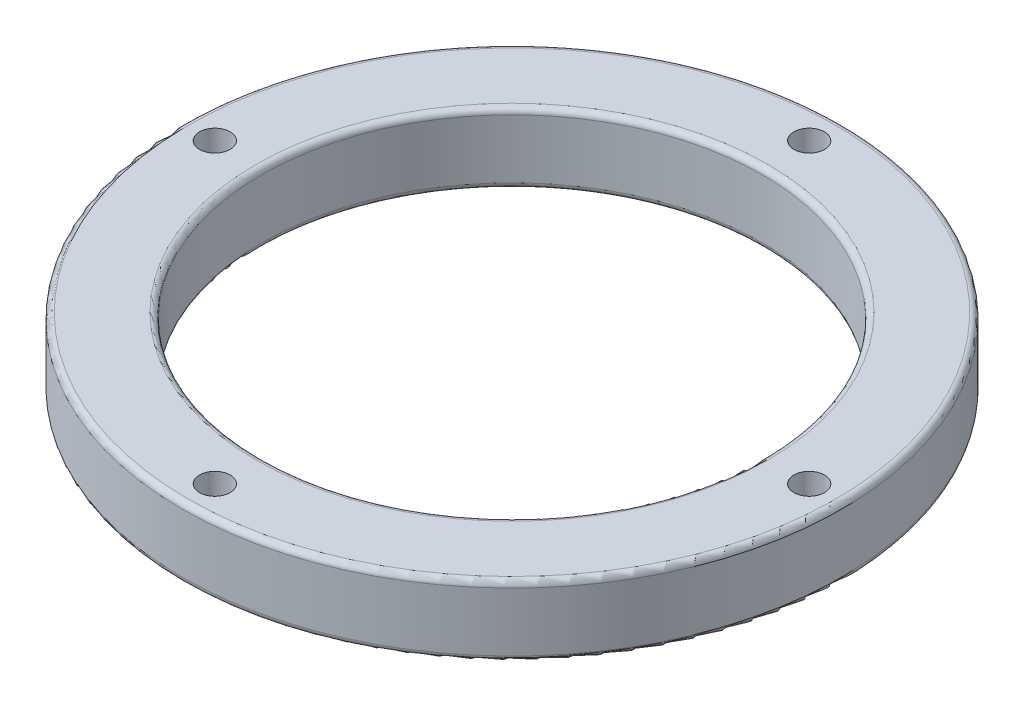
ISO-10303-21;
HEADER;
FILE_DESCRIPTION(('STEP AP214'),'2;1');
FILE_NAME('part.step','',(''),(''),'','','');
FILE_SCHEMA(('AUTOMOTIVE_DESIGN { 1 0 10303 214 1 1 1 1 }'));
ENDSEC;
DATA;
#1=APPLICATION_CONTEXT('core data for automotive mechanical design processes');
#2=APPLICATION_PROTOCOL_DEFINITION('international standard','automotive_design',2000,#1);
#3=PRODUCT_CONTEXT('',#1,'mechanical');
#4=PRODUCT('Part','Part','',(#3));
#5=PRODUCT_RELATED_PRODUCT_CATEGORY('part','',(#4));
#6=PRODUCT_DEFINITION_FORMATION('','',#4);
#7=PRODUCT_DEFINITION_CONTEXT('part definition',#1,'design');
#8=PRODUCT_DEFINITION('design','',#6,#7);
#9=PRODUCT_DEFINITION_SHAPE('','',#8);
#10=(LENGTH_UNIT() NAMED_UNIT(*) SI_UNIT(.MILLI.,.METRE.));
#11=(NAMED_UNIT(*) PLANE_ANGLE_UNIT() SI_UNIT($,.RADIAN.));
#12=(NAMED_UNIT(*) SI_UNIT($,.STERADIAN.) SOLID_ANGLE_UNIT());
#13=UNCERTAINTY_MEASURE_WITH_UNIT(LENGTH_MEASURE(1.E-05),#10,'distance_accuracy_value','');
#14=(GEOMETRIC_REPRESENTATION_CONTEXT(3) GLOBAL_UNCERTAINTY_ASSIGNED_CONTEXT((#13)) GLOBAL_UNIT_ASSIGNED_CONTEXT((#10,
#11,#12)) REPRESENTATION_CONTEXT('',''));
#15=CARTESIAN_POINT('',(0.,0.,0.));
#16=DIRECTION('',(0.,0.,1.));
#17=DIRECTION('',(1.,0.,0.));
#18=AXIS2_PLACEMENT_3D('',#15,#16,#17);
#19=CARTESIAN_POINT('',(0.,12.,0.));
#20=DIRECTION('',(0.,1.,0.));
#21=DIRECTION('',(0.,0.,1.));
#22=AXIS2_PLACEMENT_3D('',#19,#20,#21);
#23=PLANE('',#22);
#24=CARTESIAN_POINT('',(0.,12.,0.));
#25=DIRECTION('',(0.,1.,0.));
#26=DIRECTION('',(0.,0.,1.));
#27=AXIS2_PLACEMENT_3D('',#24,#25,#26);
#28=CIRCLE('',#27,55.);
#29=CARTESIAN_POINT('',(0.,12.,55.));
#30=VERTEX_POINT('',#29);
#31=EDGE_CURVE('E43',#30,#30,#28,.T.);
#32=ORIENTED_EDGE('',*,*,#31,.T.);
#33=EDGE_LOOP('',(#32));
#34=FACE_BOUND('',#33,.T.);
#35=CARTESIAN_POINT('',(0.,12.,0.));
#36=DIRECTION('',(0.,1.,0.));
#37=DIRECTION('',(0.,0.,1.));
#38=AXIS2_PLACEMENT_3D('',#35,#36,#37);
#39=CIRCLE('',#38,43.5);
#40=CARTESIAN_POINT('',(0.,12.,43.5));
#41=VERTEX_POINT('',#40);
#42=EDGE_CURVE('E47',#41,#41,#39,.F.);
#43=ORIENTED_EDGE('',*,*,#42,.T.);
#44=EDGE_LOOP('',(#43));
#45=FACE_BOUND('',#44,.T.);
#46=CARTESIAN_POINT('',(-50.5,12.,0.));
#47=DIRECTION('',(0.,1.,0.));
#48=DIRECTION('',(0.,0.,1.));
#49=AXIS2_PLACEMENT_3D('',#46,#47,#48);
#50=CIRCLE('',#49,2.6);
#51=CARTESIAN_POINT('',(-50.5,12.,2.6));
#52=VERTEX_POINT('',#51);
#53=EDGE_CURVE('E74',#52,#52,#50,.T.);
#54=ORIENTED_EDGE('',*,*,#53,.F.);
#55=EDGE_LOOP('',(#54));
#56=FACE_BOUND('',#55,.T.);
#57=CARTESIAN_POINT('',(50.5,12.,0.));
#58=DIRECTION('',(0.,1.,0.));
#59=DIRECTION('',(0.,0.,1.));
#60=AXIS2_PLACEMENT_3D('',#57,#58,#59);
#61=CIRCLE('',#60,2.6);
#62=CARTESIAN_POINT('',(50.5,12.,2.6));
#63=VERTEX_POINT('',#62);
#64=EDGE_CURVE('E64',#63,#63,#61,.T.);
#65=ORIENTED_EDGE('',*,*,#64,.F.);
#66=EDGE_LOOP('',(#65));
#67=FACE_BOUND('',#66,.T.);
#68=CARTESIAN_POINT('',(0.,12.,50.5));
#69=DIRECTION('',(0.,1.,0.));
#70=DIRECTION('',(0.,0.,1.));
#71=AXIS2_PLACEMENT_3D('',#68,#69,#70);
#72=CIRCLE('',#71,2.6);
#73=CARTESIAN_POINT('',(0.,12.,53.1));
#74=VERTEX_POINT('',#73);
#75=EDGE_CURVE('E68',#74,#74,#72,.T.);
#76=ORIENTED_EDGE('',*,*,#75,.F.);
#77=EDGE_LOOP('',(#76));
#78=FACE_BOUND('',#77,.T.);
#79=CARTESIAN_POINT('',(0.,12.,-50.5));
#80=DIRECTION('',(0.,1.,0.));
#81=DIRECTION('',(0.,0.,1.));
#82=AXIS2_PLACEMENT_3D('',#79,#80,#81);
#83=CIRCLE('',#82,2.6);
#84=CARTESIAN_POINT('',(0.,12.,-47.9));
#85=VERTEX_POINT('',#84);
#86=EDGE_CURVE('E80',#85,#85,#83,.T.);
#87=ORIENTED_EDGE('',*,*,#86,.F.);
#88=EDGE_LOOP('',(#87));
#89=FACE_BOUND('',#88,.T.);
#90=ADVANCED_FACE('F32',(#34,#45,#56,#67,#78,#89),#23,.T.);
#91=CARTESIAN_POINT('',(0.,0.,0.));
#92=DIRECTION('',(0.,1.,0.));
#93=DIRECTION('',(0.,0.,1.));
#94=AXIS2_PLACEMENT_3D('',#91,#92,#93);
#95=PLANE('',#94);
#96=CARTESIAN_POINT('',(0.,0.,0.));
#97=DIRECTION('',(0.,1.,0.));
#98=DIRECTION('',(0.,0.,1.));
#99=AXIS2_PLACEMENT_3D('',#96,#97,#98);
#100=CIRCLE('',#99,55.);
#101=CARTESIAN_POINT('',(0.,0.,55.));
#102=VERTEX_POINT('',#101);
#103=EDGE_CURVE('E52',#102,#102,#100,.F.);
#104=ORIENTED_EDGE('',*,*,#103,.T.);
#105=EDGE_LOOP('',(#104));
#106=FACE_BOUND('',#105,.T.);
#107=CARTESIAN_POINT('',(0.,0.,0.));
#108=DIRECTION('',(0.,1.,0.));
#109=DIRECTION('',(0.,0.,1.));
#110=AXIS2_PLACEMENT_3D('',#107,#108,#109);
#111=CIRCLE('',#110,43.5);
#112=CARTESIAN_POINT('',(0.,0.,43.5));
#113=VERTEX_POINT('',#112);
#114=EDGE_CURVE('E55',#113,#113,#111,.T.);
#115=ORIENTED_EDGE('',*,*,#114,.T.);
#116=EDGE_LOOP('',(#115));
#117=FACE_BOUND('',#116,.T.);
#118=CARTESIAN_POINT('',(50.5,0.,0.));
#119=DIRECTION('',(0.,1.,0.));
#120=DIRECTION('',(0.,0.,1.));
#121=AXIS2_PLACEMENT_3D('',#118,#119,#120);
#122=CIRCLE('',#121,2.6);
#123=CARTESIAN_POINT('',(50.5,0.,2.6));
#124=VERTEX_POINT('',#123);
#125=EDGE_CURVE('E65',#124,#124,#122,.T.);
#126=ORIENTED_EDGE('',*,*,#125,.T.);
#127=EDGE_LOOP('',(#126));
#128=FACE_BOUND('',#127,.T.);
#129=CARTESIAN_POINT('',(0.,0.,50.5));
#130=DIRECTION('',(0.,1.,0.));
#131=DIRECTION('',(0.,0.,1.));
#132=AXIS2_PLACEMENT_3D('',#129,#130,#131);
#133=CIRCLE('',#132,2.6);
#134=CARTESIAN_POINT('',(0.,0.,53.1));
#135=VERTEX_POINT('',#134);
#136=EDGE_CURVE('E71',#135,#135,#133,.T.);
#137=ORIENTED_EDGE('',*,*,#136,.T.);
#138=EDGE_LOOP('',(#137));
#139=FACE_BOUND('',#138,.T.);
#140=CARTESIAN_POINT('',(-50.5,0.,0.));
#141=DIRECTION('',(0.,1.,0.));
#142=DIRECTION('',(0.,0.,1.));
#143=AXIS2_PLACEMENT_3D('',#140,#141,#142);
#144=CIRCLE('',#143,2.6);
#145=CARTESIAN_POINT('',(-50.5,0.,2.6));
#146=VERTEX_POINT('',#145);
#147=EDGE_CURVE('E77',#146,#146,#144,.T.);
#148=ORIENTED_EDGE('',*,*,#147,.T.);
#149=EDGE_LOOP('',(#148));
#150=FACE_BOUND('',#149,.T.);
#151=CARTESIAN_POINT('',(0.,0.,-50.5));
#152=DIRECTION('',(0.,1.,0.));
#153=DIRECTION('',(0.,0.,1.));
#154=AXIS2_PLACEMENT_3D('',#151,#152,#153);
#155=CIRCLE('',#154,2.6);
#156=CARTESIAN_POINT('',(0.,0.,-47.9));
#157=VERTEX_POINT('',#156);
#158=EDGE_CURVE('E83',#157,#157,#155,.T.);
#159=ORIENTED_EDGE('',*,*,#158,.T.);
#160=EDGE_LOOP('',(#159));
#161=FACE_BOUND('',#160,.T.);
#162=ADVANCED_FACE('F93',(#106,#117,#128,#139,#150,#161),#95,.F.);
#163=CARTESIAN_POINT('',(0.,12.,0.));
#164=DIRECTION('',(0.,-1.,0.));
#165=DIRECTION('',(0.,0.,-1.));
#166=AXIS2_PLACEMENT_3D('',#163,#164,#165);
#167=CYLINDRICAL_SURFACE('',#166,56.);
#168=CARTESIAN_POINT('',(0.,1.,0.));
#169=DIRECTION('',(0.,1.,0.));
#170=DIRECTION('',(0.,0.,1.));
#171=AXIS2_PLACEMENT_3D('',#168,#169,#170);
#172=CIRCLE('',#171,56.);
#173=CARTESIAN_POINT('',(0.,1.,56.));
#174=VERTEX_POINT('',#173);
#175=EDGE_CURVE('E58',#174,#174,#172,.T.);
#176=ORIENTED_EDGE('',*,*,#175,.T.);
#177=EDGE_LOOP('',(#176));
#178=FACE_BOUND('',#177,.T.);
#179=CARTESIAN_POINT('',(0.,11.,0.));
#180=DIRECTION('',(0.,1.,0.));
#181=DIRECTION('',(0.,0.,1.));
#182=AXIS2_PLACEMENT_3D('',#179,#180,#181);
#183=CIRCLE('',#182,56.);
#184=CARTESIAN_POINT('',(0.,11.,56.));
#185=VERTEX_POINT('',#184);
#186=EDGE_CURVE('E61',#185,#185,#183,.F.);
#187=ORIENTED_EDGE('',*,*,#186,.T.);
#188=EDGE_LOOP('',(#187));
#189=FACE_BOUND('',#188,.T.);
#190=ADVANCED_FACE('F99',(#178,#189),#167,.T.);
#191=CARTESIAN_POINT('',(0.,12.,0.));
#192=DIRECTION('',(0.,-1.,0.));
#193=DIRECTION('',(0.,0.,-1.));
#194=AXIS2_PLACEMENT_3D('',#191,#192,#193);
#195=CYLINDRICAL_SURFACE('',#194,42.5);
#196=CARTESIAN_POINT('',(0.,1.,0.));
#197=DIRECTION('',(0.,1.,0.));
#198=DIRECTION('',(0.,0.,1.));
#199=AXIS2_PLACEMENT_3D('',#196,#197,#198);
#200=CIRCLE('',#199,42.5);
#201=CARTESIAN_POINT('',(0.,1.,42.5));
#202=VERTEX_POINT('',#201);
#203=EDGE_CURVE('E10',#202,#202,#200,.F.);
#204=ORIENTED_EDGE('',*,*,#203,.T.);
#205=EDGE_LOOP('',(#204));
#206=FACE_BOUND('',#205,.T.);
#207=CARTESIAN_POINT('',(0.,11.,0.));
#208=DIRECTION('',(0.,1.,0.));
#209=DIRECTION('',(0.,0.,1.));
#210=AXIS2_PLACEMENT_3D('',#207,#208,#209);
#211=CIRCLE('',#210,42.5);
#212=CARTESIAN_POINT('',(0.,11.,42.5));
#213=VERTEX_POINT('',#212);
#214=EDGE_CURVE('E39',#213,#213,#211,.T.);
#215=ORIENTED_EDGE('',*,*,#214,.T.);
#216=EDGE_LOOP('',(#215));
#217=FACE_BOUND('',#216,.T.);
#218=ADVANCED_FACE('F104',(#206,#217),#195,.F.);
#219=CARTESIAN_POINT('',(50.5,12.,0.));
#220=DIRECTION('',(0.,-1.,0.));
#221=DIRECTION('',(0.,0.,-1.));
#222=AXIS2_PLACEMENT_3D('',#219,#220,#221);
#223=CYLINDRICAL_SURFACE('',#222,2.6);
#224=ORIENTED_EDGE('',*,*,#64,.T.);
#225=EDGE_LOOP('',(#224));
#226=FACE_BOUND('',#225,.T.);
#227=ORIENTED_EDGE('',*,*,#125,.F.);
#228=EDGE_LOOP('',(#227));
#229=FACE_BOUND('',#228,.T.);
#230=ADVANCED_FACE('F146',(#226,#229),#223,.F.);
#231=CARTESIAN_POINT('',(0.,12.,50.5));
#232=DIRECTION('',(0.,-1.,0.));
#233=DIRECTION('',(0.,0.,-1.));
#234=AXIS2_PLACEMENT_3D('',#231,#232,#233);
#235=CYLINDRICAL_SURFACE('',#234,2.6);
#236=ORIENTED_EDGE('',*,*,#75,.T.);
#237=EDGE_LOOP('',(#236));
#238=FACE_BOUND('',#237,.T.);
#239=ORIENTED_EDGE('',*,*,#136,.F.);
#240=EDGE_LOOP('',(#239));
#241=FACE_BOUND('',#240,.T.);
#242=ADVANCED_FACE('F141',(#238,#241),#235,.F.);
#243=CARTESIAN_POINT('',(-50.5,12.,0.));
#244=DIRECTION('',(0.,-1.,0.));
#245=DIRECTION('',(0.,0.,-1.));
#246=AXIS2_PLACEMENT_3D('',#243,#244,#245);
#247=CYLINDRICAL_SURFACE('',#246,2.6);
#248=ORIENTED_EDGE('',*,*,#53,.T.);
#249=EDGE_LOOP('',(#248));
#250=FACE_BOUND('',#249,.T.);
#251=ORIENTED_EDGE('',*,*,#147,.F.);
#252=EDGE_LOOP('',(#251));
#253=FACE_BOUND('',#252,.T.);
#254=ADVANCED_FACE('F136',(#250,#253),#247,.F.);
#255=CARTESIAN_POINT('',(0.,12.,-50.5));
#256=DIRECTION('',(0.,-1.,0.));
#257=DIRECTION('',(0.,0.,-1.));
#258=AXIS2_PLACEMENT_3D('',#255,#256,#257);
#259=CYLINDRICAL_SURFACE('',#258,2.6);
#260=ORIENTED_EDGE('',*,*,#86,.T.);
#261=EDGE_LOOP('',(#260));
#262=FACE_BOUND('',#261,.T.);
#263=ORIENTED_EDGE('',*,*,#158,.F.);
#264=EDGE_LOOP('',(#263));
#265=FACE_BOUND('',#264,.T.);
#266=ADVANCED_FACE('F89',(#262,#265),#259,.F.);
#267=CARTESIAN_POINT('',(0.,1.,0.));
#268=DIRECTION('',(0.,1.,0.));
#269=DIRECTION('',(0.,0.,1.));
#270=AXIS2_PLACEMENT_3D('',#267,#268,#269);
#271=TOROIDAL_SURFACE('',#270,55.,1.);
#272=ORIENTED_EDGE('',*,*,#103,.F.);
#273=EDGE_LOOP('',(#272));
#274=FACE_BOUND('',#273,.T.);
#275=ORIENTED_EDGE('',*,*,#175,.F.);
#276=EDGE_LOOP('',(#275));
#277=FACE_BOUND('',#276,.T.);
#278=ADVANCED_FACE('F110',(#274,#277),#271,.T.);
#279=CARTESIAN_POINT('',(0.,11.,0.));
#280=DIRECTION('',(0.,1.,0.));
#281=DIRECTION('',(0.,0.,1.));
#282=AXIS2_PLACEMENT_3D('',#279,#280,#281);
#283=TOROIDAL_SURFACE('',#282,55.,1.);
#284=ORIENTED_EDGE('',*,*,#186,.F.);
#285=EDGE_LOOP('',(#284));
#286=FACE_BOUND('',#285,.T.);
#287=ORIENTED_EDGE('',*,*,#31,.F.);
#288=EDGE_LOOP('',(#287));
#289=FACE_BOUND('',#288,.T.);
#290=ADVANCED_FACE('F113',(#286,#289),#283,.T.);
#291=CARTESIAN_POINT('',(0.,1.,0.));
#292=DIRECTION('',(0.,1.,0.));
#293=DIRECTION('',(0.,0.,1.));
#294=AXIS2_PLACEMENT_3D('',#291,#292,#293);
#295=TOROIDAL_SURFACE('',#294,43.5,1.);
#296=ORIENTED_EDGE('',*,*,#203,.F.);
#297=EDGE_LOOP('',(#296));
#298=FACE_BOUND('',#297,.T.);
#299=ORIENTED_EDGE('',*,*,#114,.F.);
#300=EDGE_LOOP('',(#299));
#301=FACE_BOUND('',#300,.T.);
#302=ADVANCED_FACE('F116',(#298,#301),#295,.T.);
#303=CARTESIAN_POINT('',(0.,11.,0.));
#304=DIRECTION('',(0.,1.,0.));
#305=DIRECTION('',(0.,0.,1.));
#306=AXIS2_PLACEMENT_3D('',#303,#304,#305);
#307=TOROIDAL_SURFACE('',#306,43.5,1.);
#308=ORIENTED_EDGE('',*,*,#42,.F.);
#309=EDGE_LOOP('',(#308));
#310=FACE_BOUND('',#309,.T.);
#311=ORIENTED_EDGE('',*,*,#214,.F.);
#312=EDGE_LOOP('',(#311));
#313=FACE_BOUND('',#312,.T.);
#314=ADVANCED_FACE('F34',(#310,#313),#307,.T.);
#315=CLOSED_SHELL('',(#90,#162,#190,#218,#230,#242,#254,#266,#278,#290,#302,#314));
#316=MANIFOLD_SOLID_BREP('B2',#315);
#317=ADVANCED_BREP_SHAPE_REPRESENTATION('',(#18,#316),#14);
#318=SHAPE_DEFINITION_REPRESENTATION(#9,#317);
ENDSEC;
END-ISO-10303-21;
